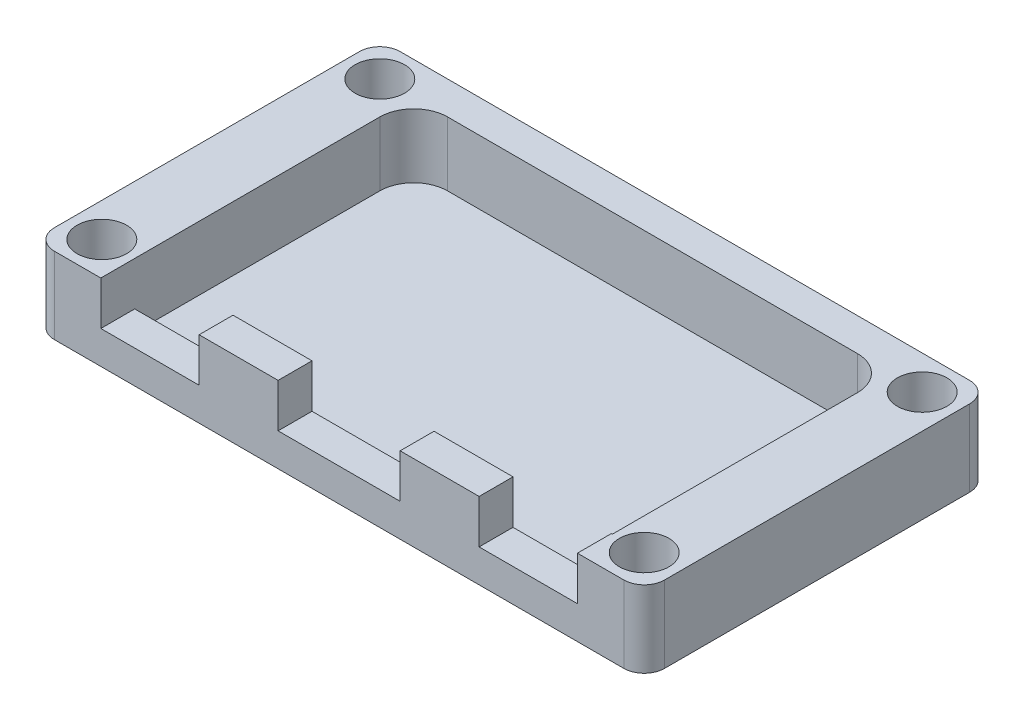
ISO-10303-21;
HEADER;
FILE_DESCRIPTION(('STEP AP214'),'2;1');
FILE_NAME('part.step','',(''),(''),'','','');
FILE_SCHEMA(('AUTOMOTIVE_DESIGN { 1 0 10303 214 1 1 1 1 }'));
ENDSEC;
DATA;
#1=APPLICATION_CONTEXT('core data for automotive mechanical design processes');
#2=APPLICATION_PROTOCOL_DEFINITION('international standard','automotive_design',2000,#1);
#3=PRODUCT_CONTEXT('',#1,'mechanical');
#4=PRODUCT('Part','Part','',(#3));
#5=PRODUCT_RELATED_PRODUCT_CATEGORY('part','',(#4));
#6=PRODUCT_DEFINITION_FORMATION('','',#4);
#7=PRODUCT_DEFINITION_CONTEXT('part definition',#1,'design');
#8=PRODUCT_DEFINITION('design','',#6,#7);
#9=PRODUCT_DEFINITION_SHAPE('','',#8);
#10=(LENGTH_UNIT() NAMED_UNIT(*) SI_UNIT(.MILLI.,.METRE.));
#11=(NAMED_UNIT(*) PLANE_ANGLE_UNIT() SI_UNIT($,.RADIAN.));
#12=(NAMED_UNIT(*) SI_UNIT($,.STERADIAN.) SOLID_ANGLE_UNIT());
#13=UNCERTAINTY_MEASURE_WITH_UNIT(LENGTH_MEASURE(1.E-05),#10,'distance_accuracy_value','');
#14=(GEOMETRIC_REPRESENTATION_CONTEXT(3) GLOBAL_UNCERTAINTY_ASSIGNED_CONTEXT((#13)) GLOBAL_UNIT_ASSIGNED_CONTEXT((#10,
#11,#12)) REPRESENTATION_CONTEXT('',''));
#15=CARTESIAN_POINT('',(0.,0.,0.));
#16=DIRECTION('',(0.,0.,1.));
#17=DIRECTION('',(1.,0.,0.));
#18=AXIS2_PLACEMENT_3D('',#15,#16,#17);
#19=CARTESIAN_POINT('',(-40.,0.,-20.5));
#20=DIRECTION('',(0.,1.,0.));
#21=DIRECTION('',(0.,0.,1.));
#22=AXIS2_PLACEMENT_3D('',#19,#20,#21);
#23=CYLINDRICAL_SURFACE('',#22,1.6);
#24=CARTESIAN_POINT('',(-40.,0.,-20.5));
#25=DIRECTION('',(0.,1.,0.));
#26=DIRECTION('',(0.,0.,1.));
#27=AXIS2_PLACEMENT_3D('',#24,#25,#26);
#28=CIRCLE('',#27,1.6);
#29=CARTESIAN_POINT('',(-40.,0.,-18.9));
#30=VERTEX_POINT('',#29);
#31=EDGE_CURVE('E405',#30,#30,#28,.T.);
#32=ORIENTED_EDGE('',*,*,#31,.F.);
#33=EDGE_LOOP('',(#32));
#34=FACE_BOUND('',#33,.T.);
#35=CARTESIAN_POINT('',(-40.,6.1,-20.5));
#36=DIRECTION('',(0.,1.,0.));
#37=DIRECTION('',(0.,0.,1.));
#38=AXIS2_PLACEMENT_3D('',#35,#36,#37);
#39=CIRCLE('',#38,1.6);
#40=CARTESIAN_POINT('',(-40.,6.1,-18.9));
#41=VERTEX_POINT('',#40);
#42=EDGE_CURVE('E391',#41,#41,#39,.F.);
#43=ORIENTED_EDGE('',*,*,#42,.F.);
#44=EDGE_LOOP('',(#43));
#45=FACE_BOUND('',#44,.T.);
#46=ADVANCED_FACE('F112',(#34,#45),#23,.F.);
#47=CARTESIAN_POINT('',(40.,0.,20.5));
#48=DIRECTION('',(0.,1.,0.));
#49=DIRECTION('',(0.,0.,1.));
#50=AXIS2_PLACEMENT_3D('',#47,#48,#49);
#51=CYLINDRICAL_SURFACE('',#50,1.6);
#52=CARTESIAN_POINT('',(40.,0.,20.5));
#53=DIRECTION('',(0.,1.,0.));
#54=DIRECTION('',(0.,0.,1.));
#55=AXIS2_PLACEMENT_3D('',#52,#53,#54);
#56=CIRCLE('',#55,1.6);
#57=CARTESIAN_POINT('',(40.,0.,22.1));
#58=VERTEX_POINT('',#57);
#59=EDGE_CURVE('E406',#58,#58,#56,.T.);
#60=ORIENTED_EDGE('',*,*,#59,.F.);
#61=EDGE_LOOP('',(#60));
#62=FACE_BOUND('',#61,.T.);
#63=CARTESIAN_POINT('',(40.,6.1,20.5));
#64=DIRECTION('',(0.,1.,0.));
#65=DIRECTION('',(0.,0.,1.));
#66=AXIS2_PLACEMENT_3D('',#63,#64,#65);
#67=CIRCLE('',#66,1.6);
#68=CARTESIAN_POINT('',(40.,6.1,22.1));
#69=VERTEX_POINT('',#68);
#70=EDGE_CURVE('E528',#69,#69,#67,.F.);
#71=ORIENTED_EDGE('',*,*,#70,.F.);
#72=EDGE_LOOP('',(#71));
#73=FACE_BOUND('',#72,.T.);
#74=ADVANCED_FACE('F716',(#62,#73),#51,.F.);
#75=CARTESIAN_POINT('',(0.,11.3,0.));
#76=DIRECTION('',(0.,1.,0.));
#77=DIRECTION('',(0.,0.,1.));
#78=AXIS2_PLACEMENT_3D('',#75,#76,#77);
#79=PLANE('',#78);
#80=DIRECTION('',(0.,0.,1.));
#81=VECTOR('',#80,1.);
#82=CARTESIAN_POINT('',(-35.15,11.3,0.));
#83=LINE('',#82,#81);
#84=CARTESIAN_POINT('',(-35.15,11.3,-15.65));
#85=VERTEX_POINT('',#84);
#86=CARTESIAN_POINT('',(-35.15,11.3,25.5));
#87=VERTEX_POINT('',#86);
#88=EDGE_CURVE('E507',#85,#87,#83,.T.);
#89=ORIENTED_EDGE('',*,*,#88,.F.);
#90=CARTESIAN_POINT('',(-30.15,11.3,-15.65));
#91=DIRECTION('',(0.,1.,0.));
#92=DIRECTION('',(0.,0.,1.));
#93=AXIS2_PLACEMENT_3D('',#90,#91,#92);
#94=CIRCLE('',#93,5.);
#95=CARTESIAN_POINT('',(-30.15,11.3,-20.65));
#96=VERTEX_POINT('',#95);
#97=EDGE_CURVE('E12',#85,#96,#94,.F.);
#98=ORIENTED_EDGE('',*,*,#97,.T.);
#99=DIRECTION('',(1.,0.,0.));
#100=VECTOR('',#99,1.);
#101=CARTESIAN_POINT('',(0.,11.3,-20.65));
#102=LINE('',#101,#100);
#103=CARTESIAN_POINT('',(30.3,11.3,-20.65));
#104=VERTEX_POINT('',#103);
#105=EDGE_CURVE('E429',#96,#104,#102,.T.);
#106=ORIENTED_EDGE('',*,*,#105,.T.);
#107=CARTESIAN_POINT('',(30.3,11.3,-15.65));
#108=DIRECTION('',(0.,1.,0.));
#109=DIRECTION('',(0.,0.,1.));
#110=AXIS2_PLACEMENT_3D('',#107,#108,#109);
#111=CIRCLE('',#110,5.);
#112=CARTESIAN_POINT('',(35.3,11.3,-15.65));
#113=VERTEX_POINT('',#112);
#114=EDGE_CURVE('E121',#104,#113,#111,.F.);
#115=ORIENTED_EDGE('',*,*,#114,.T.);
#116=DIRECTION('',(0.,0.,1.));
#117=VECTOR('',#116,1.);
#118=CARTESIAN_POINT('',(35.3,11.3,0.));
#119=LINE('',#118,#117);
#120=CARTESIAN_POINT('',(35.3,11.3,20.5));
#121=VERTEX_POINT('',#120);
#122=EDGE_CURVE('E436',#113,#121,#119,.T.);
#123=ORIENTED_EDGE('',*,*,#122,.T.);
#124=DIRECTION('',(1.,0.,0.));
#125=VECTOR('',#124,1.);
#126=CARTESIAN_POINT('',(-35.15,11.3,20.5));
#127=LINE('',#126,#125);
#128=CARTESIAN_POINT('',(35.15,11.3,20.5));
#129=VERTEX_POINT('',#128);
#130=EDGE_CURVE('E298',#129,#121,#127,.T.);
#131=ORIENTED_EDGE('',*,*,#130,.F.);
#132=DIRECTION('',(0.,0.,1.));
#133=VECTOR('',#132,1.);
#134=CARTESIAN_POINT('',(35.15,11.3,0.));
#135=LINE('',#134,#133);
#136=CARTESIAN_POINT('',(35.15,11.3,25.5));
#137=VERTEX_POINT('',#136);
#138=EDGE_CURVE('E495',#129,#137,#135,.T.);
#139=ORIENTED_EDGE('',*,*,#138,.T.);
#140=DIRECTION('',(1.,0.,0.));
#141=VECTOR('',#140,1.);
#142=CARTESIAN_POINT('',(0.,11.3,25.5));
#143=LINE('',#142,#141);
#144=CARTESIAN_POINT('',(42.,11.3,25.5));
#145=VERTEX_POINT('',#144);
#146=EDGE_CURVE('E498',#137,#145,#143,.T.);
#147=ORIENTED_EDGE('',*,*,#146,.T.);
#148=CARTESIAN_POINT('',(42.,11.3,22.5));
#149=DIRECTION('',(0.,1.,0.));
#150=DIRECTION('',(0.,0.,1.));
#151=AXIS2_PLACEMENT_3D('',#148,#149,#150);
#152=CIRCLE('',#151,3.);
#153=CARTESIAN_POINT('',(45.,11.3,22.5));
#154=VERTEX_POINT('',#153);
#155=EDGE_CURVE('E567',#145,#154,#152,.T.);
#156=ORIENTED_EDGE('',*,*,#155,.T.);
#157=DIRECTION('',(0.,0.,1.));
#158=VECTOR('',#157,1.);
#159=CARTESIAN_POINT('',(45.,11.3,25.5));
#160=LINE('',#159,#158);
#161=CARTESIAN_POINT('',(45.,11.3,-22.5));
#162=VERTEX_POINT('',#161);
#163=EDGE_CURVE('E417',#162,#154,#160,.T.);
#164=ORIENTED_EDGE('',*,*,#163,.F.);
#165=CARTESIAN_POINT('',(42.,11.3,-22.5));
#166=DIRECTION('',(0.,1.,0.));
#167=DIRECTION('',(0.,0.,1.));
#168=AXIS2_PLACEMENT_3D('',#165,#166,#167);
#169=CIRCLE('',#168,3.);
#170=CARTESIAN_POINT('',(42.,11.3,-25.5));
#171=VERTEX_POINT('',#170);
#172=EDGE_CURVE('E570',#162,#171,#169,.T.);
#173=ORIENTED_EDGE('',*,*,#172,.T.);
#174=DIRECTION('',(-1.,0.,0.));
#175=VECTOR('',#174,1.);
#176=CARTESIAN_POINT('',(0.,11.3,-25.5));
#177=LINE('',#176,#175);
#178=CARTESIAN_POINT('',(-42.,11.3,-25.5));
#179=VERTEX_POINT('',#178);
#180=EDGE_CURVE('E502',#171,#179,#177,.T.);
#181=ORIENTED_EDGE('',*,*,#180,.T.);
#182=CARTESIAN_POINT('',(-42.,11.3,-22.5));
#183=DIRECTION('',(0.,1.,0.));
#184=DIRECTION('',(0.,0.,1.));
#185=AXIS2_PLACEMENT_3D('',#182,#183,#184);
#186=CIRCLE('',#185,3.);
#187=CARTESIAN_POINT('',(-45.,11.3,-22.5));
#188=VERTEX_POINT('',#187);
#189=EDGE_CURVE('E573',#179,#188,#186,.T.);
#190=ORIENTED_EDGE('',*,*,#189,.T.);
#191=DIRECTION('',(0.,0.,-1.));
#192=VECTOR('',#191,1.);
#193=CARTESIAN_POINT('',(-45.,11.3,25.5));
#194=LINE('',#193,#192);
#195=CARTESIAN_POINT('',(-45.,11.3,22.5));
#196=VERTEX_POINT('',#195);
#197=EDGE_CURVE('E425',#196,#188,#194,.T.);
#198=ORIENTED_EDGE('',*,*,#197,.F.);
#199=CARTESIAN_POINT('',(-42.,11.3,22.5));
#200=DIRECTION('',(0.,1.,0.));
#201=DIRECTION('',(0.,0.,1.));
#202=AXIS2_PLACEMENT_3D('',#199,#200,#201);
#203=CIRCLE('',#202,3.);
#204=CARTESIAN_POINT('',(-42.,11.3,25.5));
#205=VERTEX_POINT('',#204);
#206=EDGE_CURVE('E564',#196,#205,#203,.T.);
#207=ORIENTED_EDGE('',*,*,#206,.T.);
#208=EDGE_CURVE('E503',#205,#87,#143,.T.);
#209=ORIENTED_EDGE('',*,*,#208,.T.);
#210=EDGE_LOOP('',(#89,#98,#106,#115,#123,#131,#139,#147,#156,#164,#173,#181,#190,#198,#207,#209));
#211=FACE_BOUND('',#210,.T.);
#212=CARTESIAN_POINT('',(-40.,11.3,20.5));
#213=DIRECTION('',(0.,1.,0.));
#214=DIRECTION('',(0.,0.,-1.));
#215=AXIS2_PLACEMENT_3D('',#212,#213,#214);
#216=CIRCLE('',#215,3.64999999999999);
#217=CARTESIAN_POINT('',(-40.,11.3,16.85));
#218=VERTEX_POINT('',#217);
#219=EDGE_CURVE('E319',#218,#218,#216,.T.);
#220=ORIENTED_EDGE('',*,*,#219,.F.);
#221=EDGE_LOOP('',(#220));
#222=FACE_BOUND('',#221,.T.);
#223=CARTESIAN_POINT('',(40.,11.3,20.5));
#224=DIRECTION('',(0.,1.,0.));
#225=DIRECTION('',(0.,0.,1.));
#226=AXIS2_PLACEMENT_3D('',#223,#224,#225);
#227=CIRCLE('',#226,3.65);
#228=CARTESIAN_POINT('',(40.,11.3,24.15));
#229=VERTEX_POINT('',#228);
#230=EDGE_CURVE('E333',#229,#229,#227,.T.);
#231=ORIENTED_EDGE('',*,*,#230,.F.);
#232=EDGE_LOOP('',(#231));
#233=FACE_BOUND('',#232,.T.);
#234=CARTESIAN_POINT('',(40.,11.3,-20.5));
#235=DIRECTION('',(0.,1.,0.));
#236=DIRECTION('',(0.,0.,-1.));
#237=AXIS2_PLACEMENT_3D('',#234,#235,#236);
#238=CIRCLE('',#237,3.65);
#239=CARTESIAN_POINT('',(40.,11.3,-24.15));
#240=VERTEX_POINT('',#239);
#241=EDGE_CURVE('E325',#240,#240,#238,.T.);
#242=ORIENTED_EDGE('',*,*,#241,.F.);
#243=EDGE_LOOP('',(#242));
#244=FACE_BOUND('',#243,.T.);
#245=CARTESIAN_POINT('',(-40.,11.3,-20.5));
#246=DIRECTION('',(0.,1.,0.));
#247=DIRECTION('',(0.,0.,1.));
#248=AXIS2_PLACEMENT_3D('',#245,#246,#247);
#249=CIRCLE('',#248,3.65);
#250=CARTESIAN_POINT('',(-40.,11.3,-16.85));
#251=VERTEX_POINT('',#250);
#252=EDGE_CURVE('E324',#251,#251,#249,.T.);
#253=ORIENTED_EDGE('',*,*,#252,.F.);
#254=EDGE_LOOP('',(#253));
#255=FACE_BOUND('',#254,.T.);
#256=ADVANCED_FACE('F608',(#211,#222,#233,#244,#255),#79,.T.);
#257=CARTESIAN_POINT('',(-40.,5.,-25.5));
#258=DIRECTION('',(0.,0.,1.));
#259=DIRECTION('',(1.,0.,0.));
#260=AXIS2_PLACEMENT_3D('',#257,#258,#259);
#261=PLANE('',#260);
#262=DIRECTION('',(-1.,0.,0.));
#263=VECTOR('',#262,1.);
#264=CARTESIAN_POINT('',(-40.,0.,-25.5));
#265=LINE('',#264,#263);
#266=CARTESIAN_POINT('',(42.,0.,-25.5));
#267=VERTEX_POINT('',#266);
#268=CARTESIAN_POINT('',(-42.,0.,-25.5));
#269=VERTEX_POINT('',#268);
#270=EDGE_CURVE('E516',#267,#269,#265,.T.);
#271=ORIENTED_EDGE('',*,*,#270,.T.);
#272=DIRECTION('',(0.,-1.,0.));
#273=VECTOR('',#272,1.);
#274=CARTESIAN_POINT('',(-42.,11.3,-25.5));
#275=LINE('',#274,#273);
#276=EDGE_CURVE('E561',#269,#179,#275,.F.);
#277=ORIENTED_EDGE('',*,*,#276,.T.);
#278=ORIENTED_EDGE('',*,*,#180,.F.);
#279=DIRECTION('',(0.,-1.,0.));
#280=VECTOR('',#279,1.);
#281=CARTESIAN_POINT('',(42.,0.,-25.5));
#282=LINE('',#281,#280);
#283=EDGE_CURVE('E557',#171,#267,#282,.T.);
#284=ORIENTED_EDGE('',*,*,#283,.T.);
#285=EDGE_LOOP('',(#271,#277,#278,#284));
#286=FACE_BOUND('',#285,.T.);
#287=ADVANCED_FACE('F691',(#286),#261,.F.);
#288=CARTESIAN_POINT('',(-40.,5.,25.5));
#289=DIRECTION('',(0.,0.,-1.));
#290=DIRECTION('',(-1.,0.,0.));
#291=AXIS2_PLACEMENT_3D('',#288,#289,#290);
#292=PLANE('',#291);
#293=DIRECTION('',(1.,0.,0.));
#294=VECTOR('',#293,1.);
#295=CARTESIAN_POINT('',(-40.,0.,25.5));
#296=LINE('',#295,#294);
#297=CARTESIAN_POINT('',(-42.,0.,25.5));
#298=VERTEX_POINT('',#297);
#299=CARTESIAN_POINT('',(42.,0.,25.5));
#300=VERTEX_POINT('',#299);
#301=EDGE_CURVE('E520',#298,#300,#296,.T.);
#302=ORIENTED_EDGE('',*,*,#301,.T.);
#303=DIRECTION('',(0.,-1.,0.));
#304=VECTOR('',#303,1.);
#305=CARTESIAN_POINT('',(42.,11.3,25.5));
#306=LINE('',#305,#304);
#307=EDGE_CURVE('E587',#300,#145,#306,.F.);
#308=ORIENTED_EDGE('',*,*,#307,.T.);
#309=ORIENTED_EDGE('',*,*,#146,.F.);
#310=DIRECTION('',(0.,-1.,0.));
#311=VECTOR('',#310,1.);
#312=CARTESIAN_POINT('',(35.15,11.3,25.5));
#313=LINE('',#312,#311);
#314=CARTESIAN_POINT('',(35.15,4.85,25.5));
#315=VERTEX_POINT('',#314);
#316=EDGE_CURVE('E513',#137,#315,#313,.T.);
#317=ORIENTED_EDGE('',*,*,#316,.T.);
#318=DIRECTION('',(1.,0.,0.));
#319=VECTOR('',#318,1.);
#320=CARTESIAN_POINT('',(20.65,4.85,25.5));
#321=LINE('',#320,#319);
#322=CARTESIAN_POINT('',(20.65,4.85,25.5));
#323=VERTEX_POINT('',#322);
#324=EDGE_CURVE('E390',#323,#315,#321,.T.);
#325=ORIENTED_EDGE('',*,*,#324,.F.);
#326=DIRECTION('',(0.,-1.,0.));
#327=VECTOR('',#326,1.);
#328=CARTESIAN_POINT('',(20.65,11.3,25.5));
#329=LINE('',#328,#327);
#330=CARTESIAN_POINT('',(20.65,11.3,25.5));
#331=VERTEX_POINT('',#330);
#332=EDGE_CURVE('E457',#331,#323,#329,.T.);
#333=ORIENTED_EDGE('',*,*,#332,.F.);
#334=DIRECTION('',(1.,0.,0.));
#335=VECTOR('',#334,1.);
#336=CARTESIAN_POINT('',(0.,11.3,25.5));
#337=LINE('',#336,#335);
#338=CARTESIAN_POINT('',(9.00000000000001,11.3,25.5));
#339=VERTEX_POINT('',#338);
#340=EDGE_CURVE('E454',#339,#331,#337,.T.);
#341=ORIENTED_EDGE('',*,*,#340,.F.);
#342=DIRECTION('',(0.,-1.,0.));
#343=VECTOR('',#342,1.);
#344=CARTESIAN_POINT('',(9.00000000000001,11.3,25.5));
#345=LINE('',#344,#343);
#346=CARTESIAN_POINT('',(9.00000000000001,4.85,25.5));
#347=VERTEX_POINT('',#346);
#348=EDGE_CURVE('E460',#339,#347,#345,.T.);
#349=ORIENTED_EDGE('',*,*,#348,.T.);
#350=DIRECTION('',(1.,0.,0.));
#351=VECTOR('',#350,1.);
#352=CARTESIAN_POINT('',(-8.99999999999999,4.85,25.5));
#353=LINE('',#352,#351);
#354=CARTESIAN_POINT('',(-8.99999999999999,4.85,25.5));
#355=VERTEX_POINT('',#354);
#356=EDGE_CURVE('E374',#355,#347,#353,.T.);
#357=ORIENTED_EDGE('',*,*,#356,.F.);
#358=DIRECTION('',(0.,-1.,0.));
#359=VECTOR('',#358,1.);
#360=CARTESIAN_POINT('',(-8.99999999999999,11.3,25.5));
#361=LINE('',#360,#359);
#362=CARTESIAN_POINT('',(-8.99999999999999,11.3,25.5));
#363=VERTEX_POINT('',#362);
#364=EDGE_CURVE('E483',#363,#355,#361,.T.);
#365=ORIENTED_EDGE('',*,*,#364,.F.);
#366=DIRECTION('',(1.,0.,0.));
#367=VECTOR('',#366,1.);
#368=CARTESIAN_POINT('',(0.,11.3,25.5));
#369=LINE('',#368,#367);
#370=CARTESIAN_POINT('',(-20.65,11.3,25.5));
#371=VERTEX_POINT('',#370);
#372=EDGE_CURVE('E480',#371,#363,#369,.T.);
#373=ORIENTED_EDGE('',*,*,#372,.F.);
#374=DIRECTION('',(0.,-1.,0.));
#375=VECTOR('',#374,1.);
#376=CARTESIAN_POINT('',(-20.65,11.3,25.5));
#377=LINE('',#376,#375);
#378=CARTESIAN_POINT('',(-20.65,4.85,25.5));
#379=VERTEX_POINT('',#378);
#380=EDGE_CURVE('E486',#371,#379,#377,.T.);
#381=ORIENTED_EDGE('',*,*,#380,.T.);
#382=DIRECTION('',(1.,0.,0.));
#383=VECTOR('',#382,1.);
#384=CARTESIAN_POINT('',(-35.15,4.85,25.5));
#385=LINE('',#384,#383);
#386=CARTESIAN_POINT('',(-35.15,4.85,25.5));
#387=VERTEX_POINT('',#386);
#388=EDGE_CURVE('E356',#387,#379,#385,.T.);
#389=ORIENTED_EDGE('',*,*,#388,.F.);
#390=DIRECTION('',(0.,-1.,0.));
#391=VECTOR('',#390,1.);
#392=CARTESIAN_POINT('',(-35.15,11.3,25.5));
#393=LINE('',#392,#391);
#394=EDGE_CURVE('E510',#87,#387,#393,.T.);
#395=ORIENTED_EDGE('',*,*,#394,.F.);
#396=ORIENTED_EDGE('',*,*,#208,.F.);
#397=DIRECTION('',(0.,-1.,0.));
#398=VECTOR('',#397,1.);
#399=CARTESIAN_POINT('',(-42.,0.,25.5));
#400=LINE('',#399,#398);
#401=EDGE_CURVE('E583',#205,#298,#400,.T.);
#402=ORIENTED_EDGE('',*,*,#401,.T.);
#403=EDGE_LOOP('',(#302,#308,#309,#317,#325,#333,#341,#349,#357,#365,#373,#381,#389,#395,#396,#402));
#404=FACE_BOUND('',#403,.T.);
#405=ADVANCED_FACE('F628',(#404),#292,.F.);
#406=CARTESIAN_POINT('',(0.,0.,0.));
#407=DIRECTION('',(0.,-1.,0.));
#408=DIRECTION('',(0.,0.,-1.));
#409=AXIS2_PLACEMENT_3D('',#406,#407,#408);
#410=PLANE('',#409);
#411=CARTESIAN_POINT('',(-40.,0.,20.5));
#412=DIRECTION('',(0.,1.,0.));
#413=DIRECTION('',(0.,0.,-1.));
#414=AXIS2_PLACEMENT_3D('',#411,#412,#413);
#415=CIRCLE('',#414,1.59999999999999);
#416=CARTESIAN_POINT('',(-40.,0.,18.9));
#417=VERTEX_POINT('',#416);
#418=EDGE_CURVE('E369',#417,#417,#415,.T.);
#419=ORIENTED_EDGE('',*,*,#418,.T.);
#420=EDGE_LOOP('',(#419));
#421=FACE_BOUND('',#420,.T.);
#422=ORIENTED_EDGE('',*,*,#59,.T.);
#423=EDGE_LOOP('',(#422));
#424=FACE_BOUND('',#423,.T.);
#425=CARTESIAN_POINT('',(40.,0.,-20.5));
#426=DIRECTION('',(0.,1.,0.));
#427=DIRECTION('',(0.,0.,-1.));
#428=AXIS2_PLACEMENT_3D('',#425,#426,#427);
#429=CIRCLE('',#428,1.6);
#430=CARTESIAN_POINT('',(40.,0.,-22.1));
#431=VERTEX_POINT('',#430);
#432=EDGE_CURVE('E401',#431,#431,#429,.T.);
#433=ORIENTED_EDGE('',*,*,#432,.T.);
#434=EDGE_LOOP('',(#433));
#435=FACE_BOUND('',#434,.T.);
#436=ORIENTED_EDGE('',*,*,#31,.T.);
#437=EDGE_LOOP('',(#436));
#438=FACE_BOUND('',#437,.T.);
#439=DIRECTION('',(0.,0.,-1.));
#440=VECTOR('',#439,1.);
#441=CARTESIAN_POINT('',(-45.,0.,25.5));
#442=LINE('',#441,#440);
#443=CARTESIAN_POINT('',(-45.,0.,22.5));
#444=VERTEX_POINT('',#443);
#445=CARTESIAN_POINT('',(-45.,0.,-22.5));
#446=VERTEX_POINT('',#445);
#447=EDGE_CURVE('E421',#444,#446,#442,.T.);
#448=ORIENTED_EDGE('',*,*,#447,.T.);
#449=CARTESIAN_POINT('',(-42.,0.,-22.5));
#450=DIRECTION('',(0.,-1.,0.));
#451=DIRECTION('',(0.,0.,-1.));
#452=AXIS2_PLACEMENT_3D('',#449,#450,#451);
#453=CIRCLE('',#452,3.);
#454=EDGE_CURVE('E554',#446,#269,#453,.T.);
#455=ORIENTED_EDGE('',*,*,#454,.T.);
#456=ORIENTED_EDGE('',*,*,#270,.F.);
#457=CARTESIAN_POINT('',(42.,0.,-22.5));
#458=DIRECTION('',(0.,-1.,0.));
#459=DIRECTION('',(0.,0.,-1.));
#460=AXIS2_PLACEMENT_3D('',#457,#458,#459);
#461=CIRCLE('',#460,3.);
#462=CARTESIAN_POINT('',(45.,0.,-22.5));
#463=VERTEX_POINT('',#462);
#464=EDGE_CURVE('E551',#267,#463,#461,.T.);
#465=ORIENTED_EDGE('',*,*,#464,.T.);
#466=DIRECTION('',(0.,0.,1.));
#467=VECTOR('',#466,1.);
#468=CARTESIAN_POINT('',(45.,0.,25.5));
#469=LINE('',#468,#467);
#470=CARTESIAN_POINT('',(45.,0.,22.5));
#471=VERTEX_POINT('',#470);
#472=EDGE_CURVE('E416',#463,#471,#469,.T.);
#473=ORIENTED_EDGE('',*,*,#472,.T.);
#474=CARTESIAN_POINT('',(42.,0.,22.5));
#475=DIRECTION('',(0.,-1.,0.));
#476=DIRECTION('',(0.,0.,-1.));
#477=AXIS2_PLACEMENT_3D('',#474,#475,#476);
#478=CIRCLE('',#477,3.);
#479=EDGE_CURVE('E548',#471,#300,#478,.T.);
#480=ORIENTED_EDGE('',*,*,#479,.T.);
#481=ORIENTED_EDGE('',*,*,#301,.F.);
#482=CARTESIAN_POINT('',(-42.,0.,22.5));
#483=DIRECTION('',(0.,-1.,0.));
#484=DIRECTION('',(0.,0.,-1.));
#485=AXIS2_PLACEMENT_3D('',#482,#483,#484);
#486=CIRCLE('',#485,3.);
#487=EDGE_CURVE('E545',#298,#444,#486,.T.);
#488=ORIENTED_EDGE('',*,*,#487,.T.);
#489=EDGE_LOOP('',(#448,#455,#456,#465,#473,#480,#481,#488));
#490=FACE_BOUND('',#489,.T.);
#491=ADVANCED_FACE('F704',(#421,#424,#435,#438,#490),#410,.T.);
#492=CARTESIAN_POINT('',(35.15,11.3,0.));
#493=DIRECTION('',(1.,0.,0.));
#494=DIRECTION('',(0.,0.,-1.));
#495=AXIS2_PLACEMENT_3D('',#492,#493,#494);
#496=PLANE('',#495);
#497=ORIENTED_EDGE('',*,*,#138,.F.);
#498=DIRECTION('',(0.,-1.,0.));
#499=VECTOR('',#498,1.);
#500=CARTESIAN_POINT('',(35.15,11.3,20.5));
#501=LINE('',#500,#499);
#502=CARTESIAN_POINT('',(35.15,4.85,20.5));
#503=VERTEX_POINT('',#502);
#504=EDGE_CURVE('E302',#129,#503,#501,.T.);
#505=ORIENTED_EDGE('',*,*,#504,.T.);
#506=DIRECTION('',(0.,0.,-1.));
#507=VECTOR('',#506,1.);
#508=CARTESIAN_POINT('',(35.15,4.85,20.5));
#509=LINE('',#508,#507);
#510=EDGE_CURVE('E395',#315,#503,#509,.T.);
#511=ORIENTED_EDGE('',*,*,#510,.F.);
#512=ORIENTED_EDGE('',*,*,#316,.F.);
#513=EDGE_LOOP('',(#497,#505,#511,#512));
#514=FACE_BOUND('',#513,.T.);
#515=ADVANCED_FACE('F671',(#514),#496,.F.);
#516=CARTESIAN_POINT('',(-35.15,11.3,0.));
#517=DIRECTION('',(1.,0.,0.));
#518=DIRECTION('',(0.,0.,-1.));
#519=AXIS2_PLACEMENT_3D('',#516,#517,#518);
#520=PLANE('',#519);
#521=DIRECTION('',(0.,0.,1.));
#522=VECTOR('',#521,1.);
#523=CARTESIAN_POINT('',(-35.15,1.85,-0.800000000000002));
#524=LINE('',#523,#522);
#525=CARTESIAN_POINT('',(-35.15,1.85,-15.65));
#526=VERTEX_POINT('',#525);
#527=CARTESIAN_POINT('',(-35.15,1.85,20.5));
#528=VERTEX_POINT('',#527);
#529=EDGE_CURVE('E285',#526,#528,#524,.T.);
#530=ORIENTED_EDGE('',*,*,#529,.F.);
#531=DIRECTION('',(0.,1.,0.));
#532=VECTOR('',#531,1.);
#533=CARTESIAN_POINT('',(-35.15,11.3,-15.65));
#534=LINE('',#533,#532);
#535=EDGE_CURVE('E603',#526,#85,#534,.T.);
#536=ORIENTED_EDGE('',*,*,#535,.T.);
#537=ORIENTED_EDGE('',*,*,#88,.T.);
#538=ORIENTED_EDGE('',*,*,#394,.T.);
#539=DIRECTION('',(0.,0.,1.));
#540=VECTOR('',#539,1.);
#541=CARTESIAN_POINT('',(-35.15,4.85,20.5));
#542=LINE('',#541,#540);
#543=CARTESIAN_POINT('',(-35.15,4.85,20.5));
#544=VERTEX_POINT('',#543);
#545=EDGE_CURVE('E352',#544,#387,#542,.T.);
#546=ORIENTED_EDGE('',*,*,#545,.F.);
#547=DIRECTION('',(0.,1.,0.));
#548=VECTOR('',#547,1.);
#549=CARTESIAN_POINT('',(-35.15,1.85,20.5));
#550=LINE('',#549,#548);
#551=EDGE_CURVE('E290',#528,#544,#550,.T.);
#552=ORIENTED_EDGE('',*,*,#551,.F.);
#553=EDGE_LOOP('',(#530,#536,#537,#538,#546,#552));
#554=FACE_BOUND('',#553,.T.);
#555=ADVANCED_FACE('F618',(#554),#520,.T.);
#556=CARTESIAN_POINT('',(-8.99999999999999,11.3,0.));
#557=DIRECTION('',(1.,0.,0.));
#558=DIRECTION('',(0.,0.,-1.));
#559=AXIS2_PLACEMENT_3D('',#556,#557,#558);
#560=PLANE('',#559);
#561=ORIENTED_EDGE('',*,*,#364,.T.);
#562=DIRECTION('',(0.,0.,1.));
#563=VECTOR('',#562,1.);
#564=CARTESIAN_POINT('',(-8.99999999999999,4.85,20.5));
#565=LINE('',#564,#563);
#566=CARTESIAN_POINT('',(-8.99999999999999,4.85,20.5));
#567=VERTEX_POINT('',#566);
#568=EDGE_CURVE('E370',#567,#355,#565,.T.);
#569=ORIENTED_EDGE('',*,*,#568,.F.);
#570=DIRECTION('',(0.,-1.,0.));
#571=VECTOR('',#570,1.);
#572=CARTESIAN_POINT('',(-8.99999999999999,11.3,20.5));
#573=LINE('',#572,#571);
#574=CARTESIAN_POINT('',(-8.99999999999999,11.3,20.5));
#575=VERTEX_POINT('',#574);
#576=EDGE_CURVE('E492',#575,#567,#573,.T.);
#577=ORIENTED_EDGE('',*,*,#576,.F.);
#578=DIRECTION('',(0.,0.,1.));
#579=VECTOR('',#578,1.);
#580=CARTESIAN_POINT('',(-8.99999999999999,11.3,0.));
#581=LINE('',#580,#579);
#582=EDGE_CURVE('E469',#575,#363,#581,.T.);
#583=ORIENTED_EDGE('',*,*,#582,.T.);
#584=EDGE_LOOP('',(#561,#569,#577,#583));
#585=FACE_BOUND('',#584,.T.);
#586=ADVANCED_FACE('F643',(#585),#560,.T.);
#587=CARTESIAN_POINT('',(0.,11.3,20.5));
#588=DIRECTION('',(0.,0.,-1.));
#589=DIRECTION('',(-1.,0.,0.));
#590=AXIS2_PLACEMENT_3D('',#587,#588,#589);
#591=PLANE('',#590);
#592=DIRECTION('',(-1.,0.,0.));
#593=VECTOR('',#592,1.);
#594=CARTESIAN_POINT('',(-35.15,4.85,20.5));
#595=LINE('',#594,#593);
#596=CARTESIAN_POINT('',(-20.65,4.85,20.5));
#597=VERTEX_POINT('',#596);
#598=EDGE_CURVE('E365',#597,#544,#595,.T.);
#599=ORIENTED_EDGE('',*,*,#598,.F.);
#600=DIRECTION('',(0.,-1.,0.));
#601=VECTOR('',#600,1.);
#602=CARTESIAN_POINT('',(-20.65,11.3,20.5));
#603=LINE('',#602,#601);
#604=CARTESIAN_POINT('',(-20.65,11.3,20.5));
#605=VERTEX_POINT('',#604);
#606=EDGE_CURVE('E489',#605,#597,#603,.T.);
#607=ORIENTED_EDGE('',*,*,#606,.F.);
#608=DIRECTION('',(1.,0.,0.));
#609=VECTOR('',#608,1.);
#610=CARTESIAN_POINT('',(0.,11.3,20.5));
#611=LINE('',#610,#609);
#612=EDGE_CURVE('E473',#605,#575,#611,.T.);
#613=ORIENTED_EDGE('',*,*,#612,.T.);
#614=ORIENTED_EDGE('',*,*,#576,.T.);
#615=DIRECTION('',(-1.,0.,0.));
#616=VECTOR('',#615,1.);
#617=CARTESIAN_POINT('',(-8.99999999999999,4.85,20.5));
#618=LINE('',#617,#616);
#619=CARTESIAN_POINT('',(9.00000000000001,4.85,20.5));
#620=VERTEX_POINT('',#619);
#621=EDGE_CURVE('E357',#620,#567,#618,.T.);
#622=ORIENTED_EDGE('',*,*,#621,.F.);
#623=DIRECTION('',(0.,-1.,0.));
#624=VECTOR('',#623,1.);
#625=CARTESIAN_POINT('',(9.00000000000001,11.3,20.5));
#626=LINE('',#625,#624);
#627=CARTESIAN_POINT('',(9.00000000000001,11.3,20.5));
#628=VERTEX_POINT('',#627);
#629=EDGE_CURVE('E463',#628,#620,#626,.T.);
#630=ORIENTED_EDGE('',*,*,#629,.F.);
#631=DIRECTION('',(1.,0.,0.));
#632=VECTOR('',#631,1.);
#633=CARTESIAN_POINT('',(0.,11.3,20.5));
#634=LINE('',#633,#632);
#635=CARTESIAN_POINT('',(20.65,11.3,20.5));
#636=VERTEX_POINT('',#635);
#637=EDGE_CURVE('E447',#628,#636,#634,.T.);
#638=ORIENTED_EDGE('',*,*,#637,.T.);
#639=DIRECTION('',(0.,-1.,0.));
#640=VECTOR('',#639,1.);
#641=CARTESIAN_POINT('',(20.65,11.3,20.5));
#642=LINE('',#641,#640);
#643=CARTESIAN_POINT('',(20.65,4.85,20.5));
#644=VERTEX_POINT('',#643);
#645=EDGE_CURVE('E466',#636,#644,#642,.T.);
#646=ORIENTED_EDGE('',*,*,#645,.T.);
#647=DIRECTION('',(-1.,0.,0.));
#648=VECTOR('',#647,1.);
#649=CARTESIAN_POINT('',(20.65,4.85,20.5));
#650=LINE('',#649,#648);
#651=EDGE_CURVE('E375',#503,#644,#650,.T.);
#652=ORIENTED_EDGE('',*,*,#651,.F.);
#653=ORIENTED_EDGE('',*,*,#504,.F.);
#654=ORIENTED_EDGE('',*,*,#130,.T.);
#655=DIRECTION('',(0.,1.,0.));
#656=VECTOR('',#655,1.);
#657=CARTESIAN_POINT('',(35.3,1.85,20.5));
#658=LINE('',#657,#656);
#659=CARTESIAN_POINT('',(35.3,1.85,20.5));
#660=VERTEX_POINT('',#659);
#661=EDGE_CURVE('E294',#660,#121,#658,.T.);
#662=ORIENTED_EDGE('',*,*,#661,.F.);
#663=DIRECTION('',(1.,0.,0.));
#664=VECTOR('',#663,1.);
#665=CARTESIAN_POINT('',(-35.15,1.85,20.5));
#666=LINE('',#665,#664);
#667=EDGE_CURVE('E279',#528,#660,#666,.T.);
#668=ORIENTED_EDGE('',*,*,#667,.F.);
#669=ORIENTED_EDGE('',*,*,#551,.T.);
#670=EDGE_LOOP('',(#599,#607,#613,#614,#622,#630,#638,#646,#652,#653,#654,#662,#668,#669));
#671=FACE_BOUND('',#670,.T.);
#672=ADVANCED_FACE('F296',(#671),#591,.T.);
#673=CARTESIAN_POINT('',(-20.65,11.3,0.));
#674=DIRECTION('',(1.,0.,0.));
#675=DIRECTION('',(0.,0.,-1.));
#676=AXIS2_PLACEMENT_3D('',#673,#674,#675);
#677=PLANE('',#676);
#678=ORIENTED_EDGE('',*,*,#606,.T.);
#679=DIRECTION('',(0.,0.,-1.));
#680=VECTOR('',#679,1.);
#681=CARTESIAN_POINT('',(-20.65,4.85,20.5));
#682=LINE('',#681,#680);
#683=EDGE_CURVE('E361',#379,#597,#682,.T.);
#684=ORIENTED_EDGE('',*,*,#683,.F.);
#685=ORIENTED_EDGE('',*,*,#380,.F.);
#686=DIRECTION('',(0.,0.,1.));
#687=VECTOR('',#686,1.);
#688=CARTESIAN_POINT('',(-20.65,11.3,0.));
#689=LINE('',#688,#687);
#690=EDGE_CURVE('E477',#605,#371,#689,.T.);
#691=ORIENTED_EDGE('',*,*,#690,.F.);
#692=EDGE_LOOP('',(#678,#684,#685,#691));
#693=FACE_BOUND('',#692,.T.);
#694=ADVANCED_FACE('F636',(#693),#677,.F.);
#695=CARTESIAN_POINT('',(0.,11.3,0.));
#696=DIRECTION('',(0.,1.,0.));
#697=DIRECTION('',(0.,0.,1.));
#698=AXIS2_PLACEMENT_3D('',#695,#696,#697);
#699=PLANE('',#698);
#700=ORIENTED_EDGE('',*,*,#582,.F.);
#701=ORIENTED_EDGE('',*,*,#612,.F.);
#702=ORIENTED_EDGE('',*,*,#690,.T.);
#703=ORIENTED_EDGE('',*,*,#372,.T.);
#704=EDGE_LOOP('',(#700,#701,#702,#703));
#705=FACE_BOUND('',#704,.T.);
#706=ADVANCED_FACE('F640',(#705),#699,.T.);
#707=CARTESIAN_POINT('',(20.65,11.3,0.));
#708=DIRECTION('',(1.,0.,0.));
#709=DIRECTION('',(0.,0.,-1.));
#710=AXIS2_PLACEMENT_3D('',#707,#708,#709);
#711=PLANE('',#710);
#712=ORIENTED_EDGE('',*,*,#332,.T.);
#713=DIRECTION('',(0.,0.,1.));
#714=VECTOR('',#713,1.);
#715=CARTESIAN_POINT('',(20.65,4.85,20.5));
#716=LINE('',#715,#714);
#717=EDGE_CURVE('E386',#644,#323,#716,.T.);
#718=ORIENTED_EDGE('',*,*,#717,.F.);
#719=ORIENTED_EDGE('',*,*,#645,.F.);
#720=DIRECTION('',(0.,0.,1.));
#721=VECTOR('',#720,1.);
#722=CARTESIAN_POINT('',(20.65,11.3,0.));
#723=LINE('',#722,#721);
#724=EDGE_CURVE('E443',#636,#331,#723,.T.);
#725=ORIENTED_EDGE('',*,*,#724,.T.);
#726=EDGE_LOOP('',(#712,#718,#719,#725));
#727=FACE_BOUND('',#726,.T.);
#728=ADVANCED_FACE('F662',(#727),#711,.T.);
#729=CARTESIAN_POINT('',(9.00000000000001,11.3,0.));
#730=DIRECTION('',(1.,0.,0.));
#731=DIRECTION('',(0.,0.,-1.));
#732=AXIS2_PLACEMENT_3D('',#729,#730,#731);
#733=PLANE('',#732);
#734=ORIENTED_EDGE('',*,*,#629,.T.);
#735=DIRECTION('',(0.,0.,-1.));
#736=VECTOR('',#735,1.);
#737=CARTESIAN_POINT('',(9.00000000000001,4.85,20.5));
#738=LINE('',#737,#736);
#739=EDGE_CURVE('E379',#347,#620,#738,.T.);
#740=ORIENTED_EDGE('',*,*,#739,.F.);
#741=ORIENTED_EDGE('',*,*,#348,.F.);
#742=DIRECTION('',(0.,0.,1.));
#743=VECTOR('',#742,1.);
#744=CARTESIAN_POINT('',(9.00000000000001,11.3,0.));
#745=LINE('',#744,#743);
#746=EDGE_CURVE('E451',#628,#339,#745,.T.);
#747=ORIENTED_EDGE('',*,*,#746,.F.);
#748=EDGE_LOOP('',(#734,#740,#741,#747));
#749=FACE_BOUND('',#748,.T.);
#750=ADVANCED_FACE('F653',(#749),#733,.F.);
#751=CARTESIAN_POINT('',(0.,11.3,0.));
#752=DIRECTION('',(0.,1.,0.));
#753=DIRECTION('',(0.,0.,1.));
#754=AXIS2_PLACEMENT_3D('',#751,#752,#753);
#755=PLANE('',#754);
#756=ORIENTED_EDGE('',*,*,#724,.F.);
#757=ORIENTED_EDGE('',*,*,#637,.F.);
#758=ORIENTED_EDGE('',*,*,#746,.T.);
#759=ORIENTED_EDGE('',*,*,#340,.T.);
#760=EDGE_LOOP('',(#756,#757,#758,#759));
#761=FACE_BOUND('',#760,.T.);
#762=ADVANCED_FACE('F658',(#761),#755,.T.);
#763=CARTESIAN_POINT('',(0.,1.85,0.));
#764=DIRECTION('',(0.,1.,0.));
#765=DIRECTION('',(0.,0.,1.));
#766=AXIS2_PLACEMENT_3D('',#763,#764,#765);
#767=PLANE('',#766);
#768=DIRECTION('',(0.,0.,-1.));
#769=VECTOR('',#768,1.);
#770=CARTESIAN_POINT('',(35.3,1.85,20.5));
#771=LINE('',#770,#769);
#772=CARTESIAN_POINT('',(35.3,1.85,-15.65));
#773=VERTEX_POINT('',#772);
#774=EDGE_CURVE('E283',#660,#773,#771,.T.);
#775=ORIENTED_EDGE('',*,*,#774,.T.);
#776=CARTESIAN_POINT('',(30.3,1.85,-15.65));
#777=DIRECTION('',(0.,1.,0.));
#778=DIRECTION('',(0.,0.,1.));
#779=AXIS2_PLACEMENT_3D('',#776,#777,#778);
#780=CIRCLE('',#779,5.);
#781=CARTESIAN_POINT('',(30.3,1.85,-20.65));
#782=VERTEX_POINT('',#781);
#783=EDGE_CURVE('E600',#773,#782,#780,.T.);
#784=ORIENTED_EDGE('',*,*,#783,.T.);
#785=DIRECTION('',(-1.,0.,0.));
#786=VECTOR('',#785,1.);
#787=CARTESIAN_POINT('',(-35.15,1.85,-20.65));
#788=LINE('',#787,#786);
#789=CARTESIAN_POINT('',(-30.15,1.85,-20.65));
#790=VERTEX_POINT('',#789);
#791=EDGE_CURVE('E303',#782,#790,#788,.T.);
#792=ORIENTED_EDGE('',*,*,#791,.T.);
#793=CARTESIAN_POINT('',(-30.15,1.85,-15.65));
#794=DIRECTION('',(0.,1.,0.));
#795=DIRECTION('',(0.,0.,1.));
#796=AXIS2_PLACEMENT_3D('',#793,#794,#795);
#797=CIRCLE('',#796,5.);
#798=EDGE_CURVE('E134',#790,#526,#797,.T.);
#799=ORIENTED_EDGE('',*,*,#798,.T.);
#800=ORIENTED_EDGE('',*,*,#529,.T.);
#801=ORIENTED_EDGE('',*,*,#667,.T.);
#802=EDGE_LOOP('',(#775,#784,#792,#799,#800,#801));
#803=FACE_BOUND('',#802,.T.);
#804=ADVANCED_FACE('F281',(#803),#767,.T.);
#805=CARTESIAN_POINT('',(35.3,6.8,0.));
#806=DIRECTION('',(-1.,0.,0.));
#807=DIRECTION('',(0.,0.,1.));
#808=AXIS2_PLACEMENT_3D('',#805,#806,#807);
#809=PLANE('',#808);
#810=ORIENTED_EDGE('',*,*,#122,.F.);
#811=DIRECTION('',(0.,1.,0.));
#812=VECTOR('',#811,1.);
#813=CARTESIAN_POINT('',(35.3,1.85,-15.65));
#814=LINE('',#813,#812);
#815=EDGE_CURVE('E307',#113,#773,#814,.F.);
#816=ORIENTED_EDGE('',*,*,#815,.T.);
#817=ORIENTED_EDGE('',*,*,#774,.F.);
#818=ORIENTED_EDGE('',*,*,#661,.T.);
#819=EDGE_LOOP('',(#810,#816,#817,#818));
#820=FACE_BOUND('',#819,.T.);
#821=ADVANCED_FACE('F305',(#820),#809,.T.);
#822=CARTESIAN_POINT('',(0.,6.8,-20.65));
#823=DIRECTION('',(0.,0.,1.));
#824=DIRECTION('',(1.,0.,0.));
#825=AXIS2_PLACEMENT_3D('',#822,#823,#824);
#826=PLANE('',#825);
#827=ORIENTED_EDGE('',*,*,#791,.F.);
#828=DIRECTION('',(0.,1.,0.));
#829=VECTOR('',#828,1.);
#830=CARTESIAN_POINT('',(30.3,11.3,-20.65));
#831=LINE('',#830,#829);
#832=EDGE_CURVE('E592',#782,#104,#831,.T.);
#833=ORIENTED_EDGE('',*,*,#832,.T.);
#834=ORIENTED_EDGE('',*,*,#105,.F.);
#835=DIRECTION('',(0.,1.,0.));
#836=VECTOR('',#835,1.);
#837=CARTESIAN_POINT('',(-30.15,1.85,-20.65));
#838=LINE('',#837,#836);
#839=EDGE_CURVE('E590',#96,#790,#838,.F.);
#840=ORIENTED_EDGE('',*,*,#839,.T.);
#841=EDGE_LOOP('',(#827,#833,#834,#840));
#842=FACE_BOUND('',#841,.T.);
#843=ADVANCED_FACE('F616',(#842),#826,.T.);
#844=CARTESIAN_POINT('',(-45.,11.3,25.5));
#845=DIRECTION('',(-1.,0.,0.));
#846=DIRECTION('',(0.,0.,1.));
#847=AXIS2_PLACEMENT_3D('',#844,#845,#846);
#848=PLANE('',#847);
#849=ORIENTED_EDGE('',*,*,#197,.T.);
#850=DIRECTION('',(0.,-1.,0.));
#851=VECTOR('',#850,1.);
#852=CARTESIAN_POINT('',(-45.,0.,-22.5));
#853=LINE('',#852,#851);
#854=EDGE_CURVE('E541',#188,#446,#853,.T.);
#855=ORIENTED_EDGE('',*,*,#854,.T.);
#856=ORIENTED_EDGE('',*,*,#447,.F.);
#857=DIRECTION('',(0.,-1.,0.));
#858=VECTOR('',#857,1.);
#859=CARTESIAN_POINT('',(-45.,11.3,22.5));
#860=LINE('',#859,#858);
#861=EDGE_CURVE('E524',#444,#196,#860,.F.);
#862=ORIENTED_EDGE('',*,*,#861,.T.);
#863=EDGE_LOOP('',(#849,#855,#856,#862));
#864=FACE_BOUND('',#863,.T.);
#865=ADVANCED_FACE('F698',(#864),#848,.T.);
#866=CARTESIAN_POINT('',(45.,11.3,25.5));
#867=DIRECTION('',(1.,0.,0.));
#868=DIRECTION('',(0.,0.,-1.));
#869=AXIS2_PLACEMENT_3D('',#866,#867,#868);
#870=PLANE('',#869);
#871=ORIENTED_EDGE('',*,*,#472,.F.);
#872=DIRECTION('',(0.,-1.,0.));
#873=VECTOR('',#872,1.);
#874=CARTESIAN_POINT('',(45.,11.3,-22.5));
#875=LINE('',#874,#873);
#876=EDGE_CURVE('E580',#463,#162,#875,.F.);
#877=ORIENTED_EDGE('',*,*,#876,.T.);
#878=ORIENTED_EDGE('',*,*,#163,.T.);
#879=DIRECTION('',(0.,-1.,0.));
#880=VECTOR('',#879,1.);
#881=CARTESIAN_POINT('',(45.,0.,22.5));
#882=LINE('',#881,#880);
#883=EDGE_CURVE('E576',#154,#471,#882,.T.);
#884=ORIENTED_EDGE('',*,*,#883,.T.);
#885=EDGE_LOOP('',(#871,#877,#878,#884));
#886=FACE_BOUND('',#885,.T.);
#887=ADVANCED_FACE('F683',(#886),#870,.T.);
#888=CARTESIAN_POINT('',(40.,0.,-20.5));
#889=DIRECTION('',(0.,1.,0.));
#890=DIRECTION('',(0.,0.,1.));
#891=AXIS2_PLACEMENT_3D('',#888,#889,#890);
#892=CYLINDRICAL_SURFACE('',#891,1.6);
#893=CARTESIAN_POINT('',(40.,6.1,-20.5));
#894=DIRECTION('',(0.,-1.,0.));
#895=DIRECTION('',(0.,0.,-1.));
#896=AXIS2_PLACEMENT_3D('',#893,#894,#895);
#897=CIRCLE('',#896,1.6);
#898=CARTESIAN_POINT('',(40.,6.1,-22.1));
#899=VERTEX_POINT('',#898);
#900=EDGE_CURVE('E532',#899,#899,#897,.F.);
#901=ORIENTED_EDGE('',*,*,#900,.T.);
#902=EDGE_LOOP('',(#901));
#903=FACE_BOUND('',#902,.T.);
#904=ORIENTED_EDGE('',*,*,#432,.F.);
#905=EDGE_LOOP('',(#904));
#906=FACE_BOUND('',#905,.T.);
#907=ADVANCED_FACE('F731',(#903,#906),#892,.F.);
#908=CARTESIAN_POINT('',(-40.,0.,20.5));
#909=DIRECTION('',(0.,1.,0.));
#910=DIRECTION('',(0.,0.,1.));
#911=AXIS2_PLACEMENT_3D('',#908,#909,#910);
#912=CYLINDRICAL_SURFACE('',#911,1.59999999999999);
#913=CARTESIAN_POINT('',(-40.,6.1,20.5));
#914=DIRECTION('',(0.,-1.,0.));
#915=DIRECTION('',(0.,0.,-1.));
#916=AXIS2_PLACEMENT_3D('',#913,#914,#915);
#917=CIRCLE('',#916,1.59999999999999);
#918=CARTESIAN_POINT('',(-40.,6.1,18.9));
#919=VERTEX_POINT('',#918);
#920=EDGE_CURVE('E348',#919,#919,#917,.F.);
#921=ORIENTED_EDGE('',*,*,#920,.T.);
#922=EDGE_LOOP('',(#921));
#923=FACE_BOUND('',#922,.T.);
#924=ORIENTED_EDGE('',*,*,#418,.F.);
#925=EDGE_LOOP('',(#924));
#926=FACE_BOUND('',#925,.T.);
#927=ADVANCED_FACE('F728',(#923,#926),#912,.F.);
#928=CARTESIAN_POINT('',(0.,4.85,0.));
#929=DIRECTION('',(0.,1.,0.));
#930=DIRECTION('',(0.,0.,1.));
#931=AXIS2_PLACEMENT_3D('',#928,#929,#930);
#932=PLANE('',#931);
#933=ORIENTED_EDGE('',*,*,#568,.T.);
#934=ORIENTED_EDGE('',*,*,#356,.T.);
#935=ORIENTED_EDGE('',*,*,#739,.T.);
#936=ORIENTED_EDGE('',*,*,#621,.T.);
#937=EDGE_LOOP('',(#933,#934,#935,#936));
#938=FACE_BOUND('',#937,.T.);
#939=ADVANCED_FACE('F648',(#938),#932,.T.);
#940=CARTESIAN_POINT('',(0.,4.85,0.));
#941=DIRECTION('',(0.,1.,0.));
#942=DIRECTION('',(0.,0.,1.));
#943=AXIS2_PLACEMENT_3D('',#940,#941,#942);
#944=PLANE('',#943);
#945=ORIENTED_EDGE('',*,*,#717,.T.);
#946=ORIENTED_EDGE('',*,*,#324,.T.);
#947=ORIENTED_EDGE('',*,*,#510,.T.);
#948=ORIENTED_EDGE('',*,*,#651,.T.);
#949=EDGE_LOOP('',(#945,#946,#947,#948));
#950=FACE_BOUND('',#949,.T.);
#951=ADVANCED_FACE('F666',(#950),#944,.T.);
#952=CARTESIAN_POINT('',(0.,4.85,0.));
#953=DIRECTION('',(0.,1.,0.));
#954=DIRECTION('',(0.,0.,1.));
#955=AXIS2_PLACEMENT_3D('',#952,#953,#954);
#956=PLANE('',#955);
#957=ORIENTED_EDGE('',*,*,#545,.T.);
#958=ORIENTED_EDGE('',*,*,#388,.T.);
#959=ORIENTED_EDGE('',*,*,#683,.T.);
#960=ORIENTED_EDGE('',*,*,#598,.T.);
#961=EDGE_LOOP('',(#957,#958,#959,#960));
#962=FACE_BOUND('',#961,.T.);
#963=ADVANCED_FACE('F630',(#962),#956,.T.);
#964=CARTESIAN_POINT('',(-40.,6.1,20.5));
#965=DIRECTION('',(0.,-1.,0.));
#966=DIRECTION('',(0.,0.,-1.));
#967=AXIS2_PLACEMENT_3D('',#964,#965,#966);
#968=PLANE('',#967);
#969=CARTESIAN_POINT('',(-40.,6.1,20.5));
#970=DIRECTION('',(0.,1.,0.));
#971=DIRECTION('',(0.,0.,-1.));
#972=AXIS2_PLACEMENT_3D('',#969,#970,#971);
#973=CIRCLE('',#972,3.64999999999999);
#974=CARTESIAN_POINT('',(-40.,6.1,16.85));
#975=VERTEX_POINT('',#974);
#976=EDGE_CURVE('E337',#975,#975,#973,.T.);
#977=ORIENTED_EDGE('',*,*,#976,.T.);
#978=EDGE_LOOP('',(#977));
#979=FACE_BOUND('',#978,.T.);
#980=ORIENTED_EDGE('',*,*,#920,.F.);
#981=EDGE_LOOP('',(#980));
#982=FACE_BOUND('',#981,.T.);
#983=ADVANCED_FACE('F823',(#979,#982),#968,.F.);
#984=CARTESIAN_POINT('',(-40.,6.1,20.5));
#985=DIRECTION('',(0.,1.,0.));
#986=DIRECTION('',(0.,0.,1.));
#987=AXIS2_PLACEMENT_3D('',#984,#985,#986);
#988=CYLINDRICAL_SURFACE('',#987,3.64999999999999);
#989=ORIENTED_EDGE('',*,*,#976,.F.);
#990=EDGE_LOOP('',(#989));
#991=FACE_BOUND('',#990,.T.);
#992=ORIENTED_EDGE('',*,*,#219,.T.);
#993=EDGE_LOOP('',(#992));
#994=FACE_BOUND('',#993,.T.);
#995=ADVANCED_FACE('F829',(#991,#994),#988,.F.);
#996=CARTESIAN_POINT('',(40.,6.1,20.5));
#997=DIRECTION('',(0.,1.,0.));
#998=DIRECTION('',(0.,0.,1.));
#999=AXIS2_PLACEMENT_3D('',#996,#997,#998);
#1000=PLANE('',#999);
#1001=CARTESIAN_POINT('',(40.,6.1,20.5));
#1002=DIRECTION('',(0.,1.,0.));
#1003=DIRECTION('',(0.,0.,1.));
#1004=AXIS2_PLACEMENT_3D('',#1001,#1002,#1003);
#1005=CIRCLE('',#1004,3.65);
#1006=CARTESIAN_POINT('',(40.,6.1,24.15));
#1007=VERTEX_POINT('',#1006);
#1008=EDGE_CURVE('E329',#1007,#1007,#1005,.T.);
#1009=ORIENTED_EDGE('',*,*,#1008,.T.);
#1010=EDGE_LOOP('',(#1009));
#1011=FACE_BOUND('',#1010,.T.);
#1012=ORIENTED_EDGE('',*,*,#70,.T.);
#1013=EDGE_LOOP('',(#1012));
#1014=FACE_BOUND('',#1013,.T.);
#1015=ADVANCED_FACE('F836',(#1011,#1014),#1000,.T.);
#1016=CARTESIAN_POINT('',(40.,6.1,20.5));
#1017=DIRECTION('',(0.,1.,0.));
#1018=DIRECTION('',(0.,0.,1.));
#1019=AXIS2_PLACEMENT_3D('',#1016,#1017,#1018);
#1020=CYLINDRICAL_SURFACE('',#1019,3.65);
#1021=ORIENTED_EDGE('',*,*,#1008,.F.);
#1022=EDGE_LOOP('',(#1021));
#1023=FACE_BOUND('',#1022,.T.);
#1024=ORIENTED_EDGE('',*,*,#230,.T.);
#1025=EDGE_LOOP('',(#1024));
#1026=FACE_BOUND('',#1025,.T.);
#1027=ADVANCED_FACE('F843',(#1023,#1026),#1020,.F.);
#1028=CARTESIAN_POINT('',(40.,6.1,-20.5));
#1029=DIRECTION('',(0.,-1.,0.));
#1030=DIRECTION('',(0.,0.,-1.));
#1031=AXIS2_PLACEMENT_3D('',#1028,#1029,#1030);
#1032=PLANE('',#1031);
#1033=CARTESIAN_POINT('',(40.,6.1,-20.5));
#1034=DIRECTION('',(0.,1.,0.));
#1035=DIRECTION('',(0.,0.,-1.));
#1036=AXIS2_PLACEMENT_3D('',#1033,#1034,#1035);
#1037=CIRCLE('',#1036,3.65);
#1038=CARTESIAN_POINT('',(40.,6.1,-24.15));
#1039=VERTEX_POINT('',#1038);
#1040=EDGE_CURVE('E320',#1039,#1039,#1037,.T.);
#1041=ORIENTED_EDGE('',*,*,#1040,.T.);
#1042=EDGE_LOOP('',(#1041));
#1043=FACE_BOUND('',#1042,.T.);
#1044=ORIENTED_EDGE('',*,*,#900,.F.);
#1045=EDGE_LOOP('',(#1044));
#1046=FACE_BOUND('',#1045,.T.);
#1047=ADVANCED_FACE('F850',(#1043,#1046),#1032,.F.);
#1048=CARTESIAN_POINT('',(40.,6.1,-20.5));
#1049=DIRECTION('',(0.,1.,0.));
#1050=DIRECTION('',(0.,0.,1.));
#1051=AXIS2_PLACEMENT_3D('',#1048,#1049,#1050);
#1052=CYLINDRICAL_SURFACE('',#1051,3.65);
#1053=ORIENTED_EDGE('',*,*,#1040,.F.);
#1054=EDGE_LOOP('',(#1053));
#1055=FACE_BOUND('',#1054,.T.);
#1056=ORIENTED_EDGE('',*,*,#241,.T.);
#1057=EDGE_LOOP('',(#1056));
#1058=FACE_BOUND('',#1057,.T.);
#1059=ADVANCED_FACE('F857',(#1055,#1058),#1052,.F.);
#1060=CARTESIAN_POINT('',(-40.,6.1,-20.5));
#1061=DIRECTION('',(0.,1.,0.));
#1062=DIRECTION('',(0.,0.,1.));
#1063=AXIS2_PLACEMENT_3D('',#1060,#1061,#1062);
#1064=PLANE('',#1063);
#1065=CARTESIAN_POINT('',(-40.,6.1,-20.5));
#1066=DIRECTION('',(0.,1.,0.));
#1067=DIRECTION('',(0.,0.,1.));
#1068=AXIS2_PLACEMENT_3D('',#1065,#1066,#1067);
#1069=CIRCLE('',#1068,3.65);
#1070=CARTESIAN_POINT('',(-40.,6.1,-16.85));
#1071=VERTEX_POINT('',#1070);
#1072=EDGE_CURVE('E344',#1071,#1071,#1069,.T.);
#1073=ORIENTED_EDGE('',*,*,#1072,.T.);
#1074=EDGE_LOOP('',(#1073));
#1075=FACE_BOUND('',#1074,.T.);
#1076=ORIENTED_EDGE('',*,*,#42,.T.);
#1077=EDGE_LOOP('',(#1076));
#1078=FACE_BOUND('',#1077,.T.);
#1079=ADVANCED_FACE('F864',(#1075,#1078),#1064,.T.);
#1080=CARTESIAN_POINT('',(-40.,6.1,-20.5));
#1081=DIRECTION('',(0.,1.,0.));
#1082=DIRECTION('',(0.,0.,1.));
#1083=AXIS2_PLACEMENT_3D('',#1080,#1081,#1082);
#1084=CYLINDRICAL_SURFACE('',#1083,3.65);
#1085=ORIENTED_EDGE('',*,*,#1072,.F.);
#1086=EDGE_LOOP('',(#1085));
#1087=FACE_BOUND('',#1086,.T.);
#1088=ORIENTED_EDGE('',*,*,#252,.T.);
#1089=EDGE_LOOP('',(#1088));
#1090=FACE_BOUND('',#1089,.T.);
#1091=ADVANCED_FACE('F871',(#1087,#1090),#1084,.F.);
#1092=CARTESIAN_POINT('',(-42.,11.3,-22.5));
#1093=DIRECTION('',(0.,1.,0.));
#1094=DIRECTION('',(0.,0.,1.));
#1095=AXIS2_PLACEMENT_3D('',#1092,#1093,#1094);
#1096=CYLINDRICAL_SURFACE('',#1095,3.);
#1097=ORIENTED_EDGE('',*,*,#189,.F.);
#1098=ORIENTED_EDGE('',*,*,#276,.F.);
#1099=ORIENTED_EDGE('',*,*,#454,.F.);
#1100=ORIENTED_EDGE('',*,*,#854,.F.);
#1101=EDGE_LOOP('',(#1097,#1098,#1099,#1100));
#1102=FACE_BOUND('',#1101,.T.);
#1103=ADVANCED_FACE('F695',(#1102),#1096,.T.);
#1104=CARTESIAN_POINT('',(42.,5.,-22.5));
#1105=DIRECTION('',(0.,1.,0.));
#1106=DIRECTION('',(0.,0.,1.));
#1107=AXIS2_PLACEMENT_3D('',#1104,#1105,#1106);
#1108=CYLINDRICAL_SURFACE('',#1107,3.);
#1109=ORIENTED_EDGE('',*,*,#172,.F.);
#1110=ORIENTED_EDGE('',*,*,#876,.F.);
#1111=ORIENTED_EDGE('',*,*,#464,.F.);
#1112=ORIENTED_EDGE('',*,*,#283,.F.);
#1113=EDGE_LOOP('',(#1109,#1110,#1111,#1112));
#1114=FACE_BOUND('',#1113,.T.);
#1115=ADVANCED_FACE('F686',(#1114),#1108,.T.);
#1116=CARTESIAN_POINT('',(42.,11.3,22.5));
#1117=DIRECTION('',(0.,1.,0.));
#1118=DIRECTION('',(0.,0.,1.));
#1119=AXIS2_PLACEMENT_3D('',#1116,#1117,#1118);
#1120=CYLINDRICAL_SURFACE('',#1119,3.);
#1121=ORIENTED_EDGE('',*,*,#155,.F.);
#1122=ORIENTED_EDGE('',*,*,#307,.F.);
#1123=ORIENTED_EDGE('',*,*,#479,.F.);
#1124=ORIENTED_EDGE('',*,*,#883,.F.);
#1125=EDGE_LOOP('',(#1121,#1122,#1123,#1124));
#1126=FACE_BOUND('',#1125,.T.);
#1127=ADVANCED_FACE('F677',(#1126),#1120,.T.);
#1128=CARTESIAN_POINT('',(-42.,5.,22.5));
#1129=DIRECTION('',(0.,1.,0.));
#1130=DIRECTION('',(0.,0.,1.));
#1131=AXIS2_PLACEMENT_3D('',#1128,#1129,#1130);
#1132=CYLINDRICAL_SURFACE('',#1131,3.);
#1133=ORIENTED_EDGE('',*,*,#206,.F.);
#1134=ORIENTED_EDGE('',*,*,#861,.F.);
#1135=ORIENTED_EDGE('',*,*,#487,.F.);
#1136=ORIENTED_EDGE('',*,*,#401,.F.);
#1137=EDGE_LOOP('',(#1133,#1134,#1135,#1136));
#1138=FACE_BOUND('',#1137,.T.);
#1139=ADVANCED_FACE('F702',(#1138),#1132,.T.);
#1140=CARTESIAN_POINT('',(30.3,6.8,-15.65));
#1141=DIRECTION('',(0.,-1.,0.));
#1142=DIRECTION('',(0.,0.,-1.));
#1143=AXIS2_PLACEMENT_3D('',#1140,#1141,#1142);
#1144=CYLINDRICAL_SURFACE('',#1143,5.);
#1145=ORIENTED_EDGE('',*,*,#783,.F.);
#1146=ORIENTED_EDGE('',*,*,#815,.F.);
#1147=ORIENTED_EDGE('',*,*,#114,.F.);
#1148=ORIENTED_EDGE('',*,*,#832,.F.);
#1149=EDGE_LOOP('',(#1145,#1146,#1147,#1148));
#1150=FACE_BOUND('',#1149,.T.);
#1151=ADVANCED_FACE('F613',(#1150),#1144,.F.);
#1152=CARTESIAN_POINT('',(-30.15,11.3,-15.65));
#1153=DIRECTION('',(0.,-1.,0.));
#1154=DIRECTION('',(0.,0.,-1.));
#1155=AXIS2_PLACEMENT_3D('',#1152,#1153,#1154);
#1156=CYLINDRICAL_SURFACE('',#1155,5.);
#1157=ORIENTED_EDGE('',*,*,#798,.F.);
#1158=ORIENTED_EDGE('',*,*,#839,.F.);
#1159=ORIENTED_EDGE('',*,*,#97,.F.);
#1160=ORIENTED_EDGE('',*,*,#535,.F.);
#1161=EDGE_LOOP('',(#1157,#1158,#1159,#1160));
#1162=FACE_BOUND('',#1161,.T.);
#1163=ADVANCED_FACE('F114',(#1162),#1156,.F.);
#1164=CLOSED_SHELL('',(#46,#74,#256,#287,#405,#491,#515,#555,#586,#672,#694,#706,#728,#750,#762,
#804,#821,#843,#865,#887,#907,#927,#939,#951,#963,#983,#995,#1015,#1027,#1047,#1059,#1079,#1091,
#1103,#1115,#1127,#1139,#1151,#1163));
#1165=MANIFOLD_SOLID_BREP('B2',#1164);
#1166=ADVANCED_BREP_SHAPE_REPRESENTATION('',(#18,#1165),#14);
#1167=SHAPE_DEFINITION_REPRESENTATION(#9,#1166);
ENDSEC;
END-ISO-10303-21;
